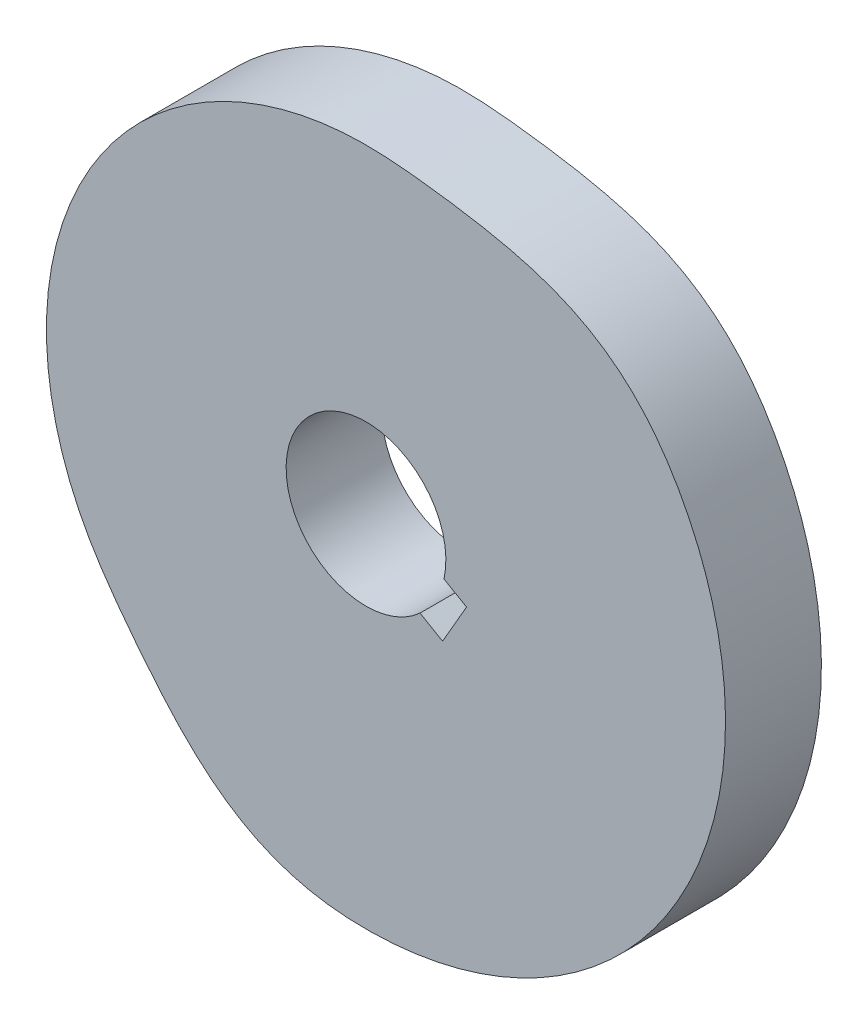
ISO-10303-21;
HEADER;
FILE_DESCRIPTION(('STEP AP214'),'2;1');
FILE_NAME('part.step','',(''),(''),'','','');
FILE_SCHEMA(('AUTOMOTIVE_DESIGN { 1 0 10303 214 1 1 1 1 }'));
ENDSEC;
DATA;
#1=APPLICATION_CONTEXT('core data for automotive mechanical design processes');
#2=APPLICATION_PROTOCOL_DEFINITION('international standard','automotive_design',2000,#1);
#3=PRODUCT_CONTEXT('',#1,'mechanical');
#4=PRODUCT('Part','Part','',(#3));
#5=PRODUCT_RELATED_PRODUCT_CATEGORY('part','',(#4));
#6=PRODUCT_DEFINITION_FORMATION('','',#4);
#7=PRODUCT_DEFINITION_CONTEXT('part definition',#1,'design');
#8=PRODUCT_DEFINITION('design','',#6,#7);
#9=PRODUCT_DEFINITION_SHAPE('','',#8);
#10=(LENGTH_UNIT() NAMED_UNIT(*) SI_UNIT(.MILLI.,.METRE.));
#11=(NAMED_UNIT(*) PLANE_ANGLE_UNIT() SI_UNIT($,.RADIAN.));
#12=(NAMED_UNIT(*) SI_UNIT($,.STERADIAN.) SOLID_ANGLE_UNIT());
#13=UNCERTAINTY_MEASURE_WITH_UNIT(LENGTH_MEASURE(1.E-05),#10,'distance_accuracy_value','');
#14=(GEOMETRIC_REPRESENTATION_CONTEXT(3) GLOBAL_UNCERTAINTY_ASSIGNED_CONTEXT((#13)) GLOBAL_UNIT_ASSIGNED_CONTEXT((#10,
#11,#12)) REPRESENTATION_CONTEXT('',''));
#15=CARTESIAN_POINT('',(0.,0.,0.));
#16=DIRECTION('',(0.,0.,1.));
#17=DIRECTION('',(1.,0.,0.));
#18=AXIS2_PLACEMENT_3D('',#15,#16,#17);
#19=CARTESIAN_POINT('',(-34.5907007104842,-20.0866237452631,12.));
#20=DIRECTION('',(0.,0.,1.));
#21=DIRECTION('',(1.,0.,0.));
#22=AXIS2_PLACEMENT_3D('',#19,#20,#21);
#23=PLANE('',#22);
#24=CARTESIAN_POINT('',(41.6040914052459,17.1493317171237,12.));
#25=CARTESIAN_POINT('',(41.1020174914144,18.3673575473884,12.));
#26=CARTESIAN_POINT('',(39.9908907436682,20.7593121750233,12.));
#27=CARTESIAN_POINT('',(38.0014596831328,24.2258629218152,12.));
#28=CARTESIAN_POINT('',(36.4606221027091,26.3698831784908,12.));
#29=CARTESIAN_POINT('',(35.6251194721866,27.3885099465134,12.));
#30=CARTESIAN_POINT('',(35.5509777435616,27.4789019412792,12.));
#31=CARTESIAN_POINT('',(35.3093521296815,27.7701037308239,12.));
#32=CARTESIAN_POINT('',(34.8916893229601,28.2548023938018,12.));
#33=CARTESIAN_POINT('',(34.3642236103499,28.835111002459,12.));
#34=CARTESIAN_POINT('',(33.8214284616267,29.4006623875112,12.));
#35=CARTESIAN_POINT('',(33.2634397017839,29.9507223900795,12.));
#36=CARTESIAN_POINT('',(32.6904898334102,30.4846075886696,12.));
#37=CARTESIAN_POINT('',(32.1029059323825,31.0016946046913,12.));
#38=CARTESIAN_POINT('',(31.5011062301754,31.5014287169865,12.));
#39=CARTESIAN_POINT('',(30.8855954460521,31.9833316448601,12.));
#40=CARTESIAN_POINT('',(30.2569589513353,32.4470083710962,12.));
#41=CARTESIAN_POINT('',(29.6158558656481,32.8921528905651,12.));
#42=CARTESIAN_POINT('',(28.9630112007715,33.3185527862826,12.));
#43=CARTESIAN_POINT('',(28.2992071813623,33.7260925527251,12.));
#44=CARTESIAN_POINT('',(27.6252738829632,34.1147556054543,12.));
#45=CARTESIAN_POINT('',(26.9420793363941,34.484624936213,12.));
#46=CARTESIAN_POINT('',(26.2505192536856,34.8358823932325,12.));
#47=CARTESIAN_POINT('',(25.5515065342268,35.1688065871312,12.));
#48=CARTESIAN_POINT('',(24.8459607108292,35.4837694431672,12.));
#49=CARTESIAN_POINT('',(24.134797494056,35.7812314404241,12.));
#50=CARTESIAN_POINT('',(23.4189185695591,36.0617355975334,12.));
#51=CARTESIAN_POINT('',(22.6992017974223,36.3259002825346,12.));
#52=CARTESIAN_POINT('',(21.9764919547547,36.5744109412834,12.));
#53=CARTESIAN_POINT('',(21.2515921531299,36.808010854258,12.));
#54=CARTESIAN_POINT('',(20.5252560510446,37.0274910455338,12.));
#55=CARTESIAN_POINT('',(19.7981809685145,37.2336794799527,12.));
#56=CARTESIAN_POINT('',(19.0710019963762,37.4274296949713,12.));
#57=CARTESIAN_POINT('',(18.3442871770079,37.6096090222078,12.));
#58=CARTESIAN_POINT('',(17.6185338162174,37.7810865602196,12.));
#59=CARTESIAN_POINT('',(16.894165968219,37.9427210644523,12.));
#60=CARTESIAN_POINT('',(16.1715331172115,38.0953489225405,12.));
#61=CARTESIAN_POINT('',(15.4509100603719,38.2397723831727,12.));
#62=CARTESIAN_POINT('',(14.7324979784421,38.3767482045367,12.));
#63=CARTESIAN_POINT('',(14.0164266618361,38.5069768839167,12.));
#64=CARTESIAN_POINT('',(13.3027578426846,38.631092623328,12.));
#65=CARTESIAN_POINT('',(12.5914895667666,38.7496541771412,12.));
#66=CARTESIAN_POINT('',(11.8825615241336,38.8631367164892,12.));
#67=CARTESIAN_POINT('',(11.175861243619,38.9719248319138,12.));
#68=CARTESIAN_POINT('',(10.47123104448,39.0763067802686,12.));
#69=CARTESIAN_POINT('',(9.76847562821939,39.176470064522,12.));
#70=CARTESIAN_POINT('',(9.06737018518749,39.2724984160128,12.));
#71=CARTESIAN_POINT('',(8.36766888386886,39.364370228242,12.));
#72=CARTESIAN_POINT('',(7.66911360575998,39.4519584698388,12.));
#73=CARTESIAN_POINT('',(6.97144278555543,39.5350320823696,12.));
#74=CARTESIAN_POINT('',(6.27440021466674,39.6132588467296,12.));
#75=CARTESIAN_POINT('',(5.5777436673017,39.6862096801998,12.));
#76=CARTESIAN_POINT('',(4.88125320765911,39.7533643061656,12.));
#77=CARTESIAN_POINT('',(4.18473905253608,39.8141182171193,12.));
#78=CARTESIAN_POINT('',(3.48804882810067,39.8677908410397,12.));
#79=CARTESIAN_POINT('',(2.7910742253825,39.9136347775381,12.));
#80=CARTESIAN_POINT('',(2.25579519350377,39.9421991135179,12.));
#81=CARTESIAN_POINT('',(1.95287633785128,39.9556761626596,12.));
#82=CARTESIAN_POINT('',(1.88247859051401,39.9586590406557,12.));
#83=CARTESIAN_POINT('',(1.46231831093852,39.976461980383,12.));
#84=CARTESIAN_POINT('',(0.621548325231796,40.0014611179778,12.));
#85=CARTESIAN_POINT('',(-0.641539846398668,40.0014894394113,12.));
#86=CARTESIAN_POINT('',(-1.48229349507988,39.974737742725,12.));
#87=CARTESIAN_POINT('',(-1.90235491205813,39.9547374636421,12.));
#88=CARTESIAN_POINT('',(-34.2028265558419,38.4168231937946,12.));
#89=CARTESIAN_POINT('',(-50.3713580964249,10.4121050817791,12.));
#90=CARTESIAN_POINT('',(-35.5529951011117,-18.3298810509051,12.));
#91=CARTESIAN_POINT('',(-35.3602851423849,-18.7036650487128,12.));
#92=CARTESIAN_POINT('',(-34.9630759669558,-19.4451549151649,12.));
#93=CARTESIAN_POINT('',(-34.3315073540373,-20.5390071983383,12.));
#94=CARTESIAN_POINT('',(-33.889472472938,-21.2546357959272,12.));
#95=CARTESIAN_POINT('',(-33.6639745350752,-21.6096038018506,12.));
#96=CARTESIAN_POINT('',(-33.6261924132981,-21.6690786003958,12.));
#97=CARTESIAN_POINT('',(-33.4630615185588,-21.9246755000866,12.));
#98=CARTESIAN_POINT('',(-33.1706845620308,-22.3739585717983,12.));
#99=CARTESIAN_POINT('',(-32.7824952470546,-22.9546343152956,12.));
#100=CARTESIAN_POINT('',(-32.3876682790341,-23.5311494362647,12.));
#101=CARTESIAN_POINT('',(-31.9867967712074,-24.1039714332199,12.));
#102=CARTESIAN_POINT('',(-31.5803939293181,-24.673572551781,12.));
#103=CARTESIAN_POINT('',(-31.1688883806231,-25.2404194027767,12.));
#104=CARTESIAN_POINT('',(-30.7526207299871,-25.8049625945056,12.));
#105=CARTESIAN_POINT('',(-30.331841461049,-26.3676264420164,12.));
#106=CARTESIAN_POINT('',(-29.906710179699,-26.928798938008,12.));
#107=CARTESIAN_POINT('',(-29.4772962057575,-27.4888221338964,12.));
#108=CARTESIAN_POINT('',(-29.0435804923669,-28.0479830825482,12.));
#109=CARTESIAN_POINT('',(-28.6054588355467,-28.6065054835503,12.));
#110=CARTESIAN_POINT('',(-28.1627463170054,-29.1645421621008,12.));
#111=CARTESIAN_POINT('',(-27.7151829051606,-29.7221685001758,12.));
#112=CARTESIAN_POINT('',(-27.2624401218827,-30.2793769248772,12.));
#113=CARTESIAN_POINT('',(-26.8041286664094,-30.8360725438215,12.));
#114=CARTESIAN_POINT('',(-26.3398068734939,-31.3920700013899,12.));
#115=CARTESIAN_POINT('',(-25.8689898705466,-31.9470916128021,12.));
#116=CARTESIAN_POINT('',(-25.3911592885762,-32.500766815457,12.));
#117=CARTESIAN_POINT('',(-24.9057733743464,-33.0526329589168,12.));
#118=CARTESIAN_POINT('',(-24.4122773464131,-33.6021374364543,12.));
#119=CARTESIAN_POINT('',(-23.9101138356203,-34.1486411423892,12.));
#120=CARTESIAN_POINT('',(-23.3987332511284,-34.6914232207099,12.));
#121=CARTESIAN_POINT('',(-22.8776039160131,-35.2296870519712,12.));
#122=CARTESIAN_POINT('',(-22.3462218217491,-35.7625674074315,12.));
#123=CARTESIAN_POINT('',(-21.8041198583108,-36.2891386821519,12.));
#124=CARTESIAN_POINT('',(-21.2508763859959,-36.8084241026055,12.));
#125=CARTESIAN_POINT('',(-20.6861230262256,-37.3194057895236,12.));
#126=CARTESIAN_POINT('',(-20.1095515613041,-37.8210355434644,12.));
#127=CARTESIAN_POINT('',(-19.5209198472419,-38.312246209164,12.));
#128=CARTESIAN_POINT('',(-18.9200566590697,-38.7919634652576,12.));
#129=CARTESIAN_POINT('',(-18.3068654043982,-39.2591178785917,12.));
#130=CARTESIAN_POINT('',(-17.6813266581237,-39.7126570571701,12.));
#131=CARTESIAN_POINT('',(-17.0434994889436,-40.1515577328405,12.));
#132=CARTESIAN_POINT('',(-16.3935215665417,-40.5748376041996,12.));
#133=CARTESIAN_POINT('',(-15.7316080567394,-40.981566771876,12.));
#134=CARTESIAN_POINT('',(-15.058049330364,-41.3708786023814,12.));
#135=CARTESIAN_POINT('',(-14.3732075298677,-41.7419798631026,12.));
#136=CARTESIAN_POINT('',(-13.6775120555671,-42.0941599797522,12.));
#137=CARTESIAN_POINT('',(-12.9714540505079,-42.4267992786674,12.));
#138=CARTESIAN_POINT('',(-12.2555799790855,-42.7393760897201,12.));
#139=CARTESIAN_POINT('',(-11.5304844093273,-43.0314726011374,12.));
#140=CARTESIAN_POINT('',(-10.7968021218384,-43.3027793750911,12.));
#141=CARTESIAN_POINT('',(-10.0551996794826,-43.553098452225,12.));
#142=CARTESIAN_POINT('',(-9.30636660061228,-43.7823449940365,12.));
#143=CARTESIAN_POINT('',(-8.551006284861,-43.9905474338023,12.));
#144=CARTESIAN_POINT('',(-7.78982684389867,-44.1778461291215,12.));
#145=CARTESIAN_POINT('',(-7.02353199046165,-44.3444905315386,12.));
#146=CARTESIAN_POINT('',(-6.39493923179174,-44.4638478008844,12.));
#147=CARTESIAN_POINT('',(-6.02193827748857,-44.5275008259357,12.));
#148=CARTESIAN_POINT('',(-5.90658564942019,-44.546513449021,12.));
#149=CARTESIAN_POINT('',(-4.60667767607008,-44.7607665679733,12.));
#150=CARTESIAN_POINT('',(-1.97948287733542,-45.0231609273912,12.));
#151=CARTESIAN_POINT('',(2.01735366318287,-45.0127833914964,12.));
#152=CARTESIAN_POINT('',(4.64441050930089,-44.7790700680491,12.));
#153=CARTESIAN_POINT('',(5.9502887776981,-44.6048659168705,12.));
#154=CARTESIAN_POINT('',(37.7852618413395,-40.358080749711,12.));
#155=CARTESIAN_POINT('',(53.8437540979118,-12.5439562683546,12.));
#156=CARTESIAN_POINT('',(41.6040914052459,17.1493317171237,12.));
#157=(BOUNDED_CURVE() B_SPLINE_CURVE(3,(#24,#25,#26,#27,#28,#29,#30,#31,#32,#33,#34,#35,#36,#37,
#38,#39,#40,#41,#42,#43,#44,#45,#46,#47,#48,#49,#50,#51,#52,#53,#54,#55,#56,#57,#58,#59,#60,#61,
#62,#63,#64,#65,#66,#67,#68,#69,#70,#71,#72,#73,#74,#75,#76,#77,#78,#79,#80,#81,#82,#83,#84,#85,
#86,#87,#88,#89,#90,#91,#92,#93,#94,#95,#96,#97,#98,#99,#100,#101,#102,#103,#104,#105,#106,#107,
#108,#109,#110,#111,#112,#113,#114,#115,#116,#117,#118,#119,#120,#121,#122,#123,#124,#125,#126,
#127,#128,#129,#130,#131,#132,#133,#134,#135,#136,#137,#138,#139,#140,#141,#142,#143,#144,#145,
#146,#147,#148,#149,#150,#151,#152,#153,#154,#155,#156),.UNSPECIFIED.,.T.,
.F.) B_SPLINE_CURVE_WITH_KNOTS((4,1,1,3,1,1,1,1,1,1,1,1,1,1,1,1,1,1,1,1,1,1,1,1,1,1,1,1,1,1,1,1,
1,1,1,1,1,1,1,1,1,1,1,1,1,1,1,1,1,1,1,1,1,1,3,1,1,3,3,1,1,3,1,1,1,1,1,1,1,1,1,1,1,1,1,1,1,1,1,1,
1,1,1,1,1,1,1,1,1,1,1,1,1,1,1,1,1,1,1,1,1,1,1,1,1,1,1,1,1,1,1,1,3,1,1,3,4),(0.,
0.0161904884466932,0.0323809768933866,0.0485714653400798,0.05000819427051,0.0532215773618582,
0.0564337692578935,0.0596446277742659,0.0628540152180113,0.0660617926902239,0.0692678124004034,
0.0724719084751493,0.0756738868277043,0.0788735147113431,0.0820705106060284,0.0852645350829743,
0.0884551832563936,0.0916419793680339,0.0948243739617943,0.0980017439975593,0.101173396130806,
0.104338573253257,0.107496464255435,0.110646216839588,0.113786953085624,0.116917787357334,
0.120037846034346,0.123146288469644,0.126242328505218,0.129325255831275,0.132394456449305,
0.135449431497699,0.13848981372212,0.141515380922946,0.14452606578958,0.147521961636664,
0.150503323689117,0.153470565719023,0.156424252013186,0.159365084839044,0.162293887769847,
0.16521158541706,0.16811918028724,0.171017727620559,0.173908309168118,0.176792006917025,
0.179669877771109,0.182542930140257,0.185412103286191,0.188278250124261,0.191142123999831,
0.194004369756258,0.196865519201976,0.199725990879079,0.200591921872403,0.205760124293804,
0.210928326715204,0.216096529136605,0.491796730957524,0.496964933379106,0.502133135800688,
0.507301338222271,0.508167269215323,0.511027740892426,0.513888890338145,0.516751136094571,
0.519615009970142,0.522481156808211,0.525350329954146,0.528223382323293,0.531101253177378,
0.533984950926285,0.536875532473844,0.539774079807163,0.542681674677343,0.545599372324556,
0.548528175255359,0.551469008081217,0.55442269437538,0.557389936405286,0.560371298457739,
0.563367194304824,0.566377879171458,0.569403446372283,0.572443828596705,0.575498803645099,
0.578568004263129,0.581650931589185,0.58474697162476,0.587855414060058,0.59097547273707,
0.59410630700878,0.597247043254816,0.600396795838969,0.603554686841147,0.606719863963598,
0.609891516096845,0.61306888613261,0.61625128072637,0.619438076838011,0.62262872501143,
0.625822749488376,0.629019745383062,0.6322193732667,0.635421351619256,0.638625447694002,
0.641831467404181,0.645039244876394,0.648248632320139,0.651459490836512,0.654671682732547,
0.657885065823895,0.6593217947542,0.675512283200976,0.691702771647752,0.707893260094528,1.),
.UNSPECIFIED.) CURVE() GEOMETRIC_REPRESENTATION_ITEM() RATIONAL_B_SPLINE_CURVE((1.,1.,1.,1.,1.,
1.,1.,1.,1.,1.,1.,1.,1.,1.,1.,1.,1.,1.,1.,1.,1.,1.,1.,1.,1.,1.,1.,1.,1.,1.,1.,1.,1.,1.,1.,1.,1.,
1.,1.,1.,1.,1.,1.,1.,1.,1.,1.,1.,1.,1.,1.,1.,1.,1.,1.,1.,1.,1.,1.,1.,1.,1.,1.,1.,
0.693747606878428,0.693747606878428,1.,1.,1.,1.,1.,1.,1.,1.,1.,1.,1.,1.,1.,1.,1.,1.,1.,1.,1.,1.,
1.,1.,1.,1.,1.,1.,1.,1.,1.,1.,1.,1.,1.,1.,1.,1.,1.,1.,1.,1.,1.,1.,1.,1.,1.,1.,1.,1.,1.,1.,1.,1.,
1.,1.,1.,1.,1.,1.,1.,1.,1.,1.,1.,1.,0.740081988144639,0.740081988144639,1.)) REPRESENTATION_ITEM(''));
#158=CARTESIAN_POINT('',(41.6040914052459,17.1493317171237,12.));
#159=VERTEX_POINT('',#158);
#160=EDGE_CURVE('E119',#159,#159,#157,.T.);
#161=ORIENTED_EDGE('',*,*,#160,.T.);
#162=EDGE_LOOP('',(#161));
#163=FACE_BOUND('',#162,.T.);
#164=DIRECTION('',(0.866025403784439,-0.5,0.));
#165=VECTOR('',#164,1.);
#166=CARTESIAN_POINT('',(9.58512512714551,-8.99807618751146,12.));
#167=LINE('',#166,#165);
#168=CARTESIAN_POINT('',(6.76135582092916,-7.36777221843804,12.));
#169=VERTEX_POINT('',#168);
#170=CARTESIAN_POINT('',(9.58512512714551,-8.99807618751146,12.));
#171=VERTEX_POINT('',#170);
#172=EDGE_CURVE('E93',#169,#171,#167,.T.);
#173=ORIENTED_EDGE('',*,*,#172,.F.);
#174=CARTESIAN_POINT('',(0.,0.,12.));
#175=DIRECTION('',(0.,0.,1.));
#176=DIRECTION('',(1.,0.,0.));
#177=AXIS2_PLACEMENT_3D('',#174,#175,#176);
#178=CIRCLE('',#177,10.);
#179=CARTESIAN_POINT('',(9.76135582092916,-2.17161979573141,12.));
#180=VERTEX_POINT('',#179);
#181=EDGE_CURVE('E84',#180,#169,#178,.T.);
#182=ORIENTED_EDGE('',*,*,#181,.F.);
#183=DIRECTION('',(-0.866025403784439,0.5,0.));
#184=VECTOR('',#183,1.);
#185=CARTESIAN_POINT('',(9.76135582092916,-2.17161979573141,12.));
#186=LINE('',#185,#184);
#187=CARTESIAN_POINT('',(12.5851251271455,-3.80192376480483,12.));
#188=VERTEX_POINT('',#187);
#189=EDGE_CURVE('E109',#188,#180,#186,.T.);
#190=ORIENTED_EDGE('',*,*,#189,.F.);
#191=DIRECTION('',(0.5,0.866025403784439,0.));
#192=VECTOR('',#191,1.);
#193=CARTESIAN_POINT('',(12.5851251271455,-3.80192376480482,12.));
#194=LINE('',#193,#192);
#195=EDGE_CURVE('E105',#171,#188,#194,.T.);
#196=ORIENTED_EDGE('',*,*,#195,.F.);
#197=EDGE_LOOP('',(#173,#182,#190,#196));
#198=FACE_BOUND('',#197,.T.);
#199=ADVANCED_FACE('F43',(#163,#198),#23,.T.);
#200=CARTESIAN_POINT('',(-34.5907007104842,-20.0866237452631,0.));
#201=DIRECTION('',(0.,0.,1.));
#202=DIRECTION('',(1.,0.,0.));
#203=AXIS2_PLACEMENT_3D('',#200,#201,#202);
#204=PLANE('',#203);
#205=CARTESIAN_POINT('',(41.6040914052459,17.1493317171237,0.));
#206=CARTESIAN_POINT('',(41.1020174914144,18.3673575473884,0.));
#207=CARTESIAN_POINT('',(39.9908907436682,20.7593121750233,0.));
#208=CARTESIAN_POINT('',(38.0014596831328,24.2258629218152,0.));
#209=CARTESIAN_POINT('',(36.4606221027091,26.3698831784908,0.));
#210=CARTESIAN_POINT('',(35.6251194721866,27.3885099465134,0.));
#211=CARTESIAN_POINT('',(35.5509777435616,27.4789019412792,0.));
#212=CARTESIAN_POINT('',(35.3093521296815,27.7701037308239,0.));
#213=CARTESIAN_POINT('',(34.8916893229601,28.2548023938018,0.));
#214=CARTESIAN_POINT('',(34.3642236103499,28.835111002459,0.));
#215=CARTESIAN_POINT('',(33.8214284616267,29.4006623875112,0.));
#216=CARTESIAN_POINT('',(33.2634397017839,29.9507223900795,0.));
#217=CARTESIAN_POINT('',(32.6904898334102,30.4846075886696,0.));
#218=CARTESIAN_POINT('',(32.1029059323825,31.0016946046913,0.));
#219=CARTESIAN_POINT('',(31.5011062301754,31.5014287169865,0.));
#220=CARTESIAN_POINT('',(30.8855954460521,31.9833316448601,0.));
#221=CARTESIAN_POINT('',(30.2569589513353,32.4470083710962,0.));
#222=CARTESIAN_POINT('',(29.6158558656481,32.8921528905651,0.));
#223=CARTESIAN_POINT('',(28.9630112007715,33.3185527862826,0.));
#224=CARTESIAN_POINT('',(28.2992071813623,33.7260925527251,0.));
#225=CARTESIAN_POINT('',(27.6252738829632,34.1147556054543,0.));
#226=CARTESIAN_POINT('',(26.9420793363941,34.484624936213,0.));
#227=CARTESIAN_POINT('',(26.2505192536856,34.8358823932325,0.));
#228=CARTESIAN_POINT('',(25.5515065342268,35.1688065871312,0.));
#229=CARTESIAN_POINT('',(24.8459607108292,35.4837694431672,0.));
#230=CARTESIAN_POINT('',(24.134797494056,35.7812314404241,0.));
#231=CARTESIAN_POINT('',(23.4189185695591,36.0617355975334,0.));
#232=CARTESIAN_POINT('',(22.6992017974223,36.3259002825346,0.));
#233=CARTESIAN_POINT('',(21.9764919547547,36.5744109412834,0.));
#234=CARTESIAN_POINT('',(21.2515921531299,36.808010854258,0.));
#235=CARTESIAN_POINT('',(20.5252560510446,37.0274910455338,0.));
#236=CARTESIAN_POINT('',(19.7981809685145,37.2336794799527,0.));
#237=CARTESIAN_POINT('',(19.0710019963762,37.4274296949713,0.));
#238=CARTESIAN_POINT('',(18.3442871770079,37.6096090222078,0.));
#239=CARTESIAN_POINT('',(17.6185338162174,37.7810865602196,0.));
#240=CARTESIAN_POINT('',(16.894165968219,37.9427210644523,0.));
#241=CARTESIAN_POINT('',(16.1715331172115,38.0953489225405,0.));
#242=CARTESIAN_POINT('',(15.4509100603719,38.2397723831727,0.));
#243=CARTESIAN_POINT('',(14.7324979784421,38.3767482045367,0.));
#244=CARTESIAN_POINT('',(14.0164266618361,38.5069768839167,0.));
#245=CARTESIAN_POINT('',(13.3027578426846,38.631092623328,0.));
#246=CARTESIAN_POINT('',(12.5914895667666,38.7496541771412,0.));
#247=CARTESIAN_POINT('',(11.8825615241336,38.8631367164892,0.));
#248=CARTESIAN_POINT('',(11.175861243619,38.9719248319138,0.));
#249=CARTESIAN_POINT('',(10.47123104448,39.0763067802686,0.));
#250=CARTESIAN_POINT('',(9.76847562821939,39.176470064522,0.));
#251=CARTESIAN_POINT('',(9.06737018518749,39.2724984160128,0.));
#252=CARTESIAN_POINT('',(8.36766888386886,39.364370228242,0.));
#253=CARTESIAN_POINT('',(7.66911360575998,39.4519584698388,0.));
#254=CARTESIAN_POINT('',(6.97144278555543,39.5350320823696,0.));
#255=CARTESIAN_POINT('',(6.27440021466674,39.6132588467296,0.));
#256=CARTESIAN_POINT('',(5.5777436673017,39.6862096801998,0.));
#257=CARTESIAN_POINT('',(4.88125320765911,39.7533643061656,0.));
#258=CARTESIAN_POINT('',(4.18473905253608,39.8141182171193,0.));
#259=CARTESIAN_POINT('',(3.48804882810067,39.8677908410397,0.));
#260=CARTESIAN_POINT('',(2.7910742253825,39.9136347775381,0.));
#261=CARTESIAN_POINT('',(2.25579519350377,39.9421991135179,0.));
#262=CARTESIAN_POINT('',(1.95287633785128,39.9556761626596,0.));
#263=CARTESIAN_POINT('',(1.88247859051401,39.9586590406557,0.));
#264=CARTESIAN_POINT('',(1.46231831093852,39.976461980383,0.));
#265=CARTESIAN_POINT('',(0.621548325231796,40.0014611179778,0.));
#266=CARTESIAN_POINT('',(-0.641539846398668,40.0014894394113,0.));
#267=CARTESIAN_POINT('',(-1.48229349507988,39.974737742725,0.));
#268=CARTESIAN_POINT('',(-1.90235491205813,39.9547374636421,0.));
#269=CARTESIAN_POINT('',(-34.2028265558419,38.4168231937946,0.));
#270=CARTESIAN_POINT('',(-50.3713580964249,10.4121050817791,0.));
#271=CARTESIAN_POINT('',(-35.5529951011117,-18.3298810509051,0.));
#272=CARTESIAN_POINT('',(-35.3602851423849,-18.7036650487128,0.));
#273=CARTESIAN_POINT('',(-34.9630759669558,-19.4451549151649,0.));
#274=CARTESIAN_POINT('',(-34.3315073540373,-20.5390071983383,0.));
#275=CARTESIAN_POINT('',(-33.889472472938,-21.2546357959272,0.));
#276=CARTESIAN_POINT('',(-33.6639745350752,-21.6096038018506,0.));
#277=CARTESIAN_POINT('',(-33.6261924132981,-21.6690786003958,0.));
#278=CARTESIAN_POINT('',(-33.4630615185588,-21.9246755000866,0.));
#279=CARTESIAN_POINT('',(-33.1706845620308,-22.3739585717983,0.));
#280=CARTESIAN_POINT('',(-32.7824952470546,-22.9546343152956,0.));
#281=CARTESIAN_POINT('',(-32.3876682790341,-23.5311494362647,0.));
#282=CARTESIAN_POINT('',(-31.9867967712074,-24.1039714332199,0.));
#283=CARTESIAN_POINT('',(-31.5803939293181,-24.673572551781,0.));
#284=CARTESIAN_POINT('',(-31.1688883806231,-25.2404194027767,0.));
#285=CARTESIAN_POINT('',(-30.7526207299871,-25.8049625945056,0.));
#286=CARTESIAN_POINT('',(-30.331841461049,-26.3676264420164,0.));
#287=CARTESIAN_POINT('',(-29.906710179699,-26.928798938008,0.));
#288=CARTESIAN_POINT('',(-29.4772962057575,-27.4888221338964,0.));
#289=CARTESIAN_POINT('',(-29.0435804923669,-28.0479830825482,0.));
#290=CARTESIAN_POINT('',(-28.6054588355467,-28.6065054835503,0.));
#291=CARTESIAN_POINT('',(-28.1627463170054,-29.1645421621008,0.));
#292=CARTESIAN_POINT('',(-27.7151829051606,-29.7221685001758,0.));
#293=CARTESIAN_POINT('',(-27.2624401218827,-30.2793769248772,0.));
#294=CARTESIAN_POINT('',(-26.8041286664094,-30.8360725438215,0.));
#295=CARTESIAN_POINT('',(-26.3398068734939,-31.3920700013899,0.));
#296=CARTESIAN_POINT('',(-25.8689898705466,-31.9470916128021,0.));
#297=CARTESIAN_POINT('',(-25.3911592885762,-32.500766815457,0.));
#298=CARTESIAN_POINT('',(-24.9057733743464,-33.0526329589168,0.));
#299=CARTESIAN_POINT('',(-24.4122773464131,-33.6021374364543,0.));
#300=CARTESIAN_POINT('',(-23.9101138356203,-34.1486411423892,0.));
#301=CARTESIAN_POINT('',(-23.3987332511284,-34.6914232207099,0.));
#302=CARTESIAN_POINT('',(-22.8776039160131,-35.2296870519712,0.));
#303=CARTESIAN_POINT('',(-22.3462218217491,-35.7625674074315,0.));
#304=CARTESIAN_POINT('',(-21.8041198583108,-36.2891386821519,0.));
#305=CARTESIAN_POINT('',(-21.2508763859959,-36.8084241026055,0.));
#306=CARTESIAN_POINT('',(-20.6861230262256,-37.3194057895236,0.));
#307=CARTESIAN_POINT('',(-20.1095515613041,-37.8210355434644,0.));
#308=CARTESIAN_POINT('',(-19.5209198472419,-38.312246209164,0.));
#309=CARTESIAN_POINT('',(-18.9200566590697,-38.7919634652576,0.));
#310=CARTESIAN_POINT('',(-18.3068654043982,-39.2591178785917,0.));
#311=CARTESIAN_POINT('',(-17.6813266581237,-39.7126570571701,0.));
#312=CARTESIAN_POINT('',(-17.0434994889436,-40.1515577328405,0.));
#313=CARTESIAN_POINT('',(-16.3935215665417,-40.5748376041996,0.));
#314=CARTESIAN_POINT('',(-15.7316080567394,-40.981566771876,0.));
#315=CARTESIAN_POINT('',(-15.058049330364,-41.3708786023814,0.));
#316=CARTESIAN_POINT('',(-14.3732075298677,-41.7419798631026,0.));
#317=CARTESIAN_POINT('',(-13.6775120555671,-42.0941599797522,0.));
#318=CARTESIAN_POINT('',(-12.9714540505079,-42.4267992786674,0.));
#319=CARTESIAN_POINT('',(-12.2555799790855,-42.7393760897201,0.));
#320=CARTESIAN_POINT('',(-11.5304844093273,-43.0314726011374,0.));
#321=CARTESIAN_POINT('',(-10.7968021218384,-43.3027793750911,0.));
#322=CARTESIAN_POINT('',(-10.0551996794826,-43.553098452225,0.));
#323=CARTESIAN_POINT('',(-9.30636660061228,-43.7823449940365,0.));
#324=CARTESIAN_POINT('',(-8.551006284861,-43.9905474338023,0.));
#325=CARTESIAN_POINT('',(-7.78982684389867,-44.1778461291215,0.));
#326=CARTESIAN_POINT('',(-7.02353199046165,-44.3444905315386,0.));
#327=CARTESIAN_POINT('',(-6.39493923179174,-44.4638478008844,0.));
#328=CARTESIAN_POINT('',(-6.02193827748857,-44.5275008259357,0.));
#329=CARTESIAN_POINT('',(-5.90658564942019,-44.546513449021,0.));
#330=CARTESIAN_POINT('',(-4.60667767607008,-44.7607665679733,0.));
#331=CARTESIAN_POINT('',(-1.97948287733542,-45.0231609273912,0.));
#332=CARTESIAN_POINT('',(2.01735366318287,-45.0127833914964,0.));
#333=CARTESIAN_POINT('',(4.64441050930089,-44.7790700680491,0.));
#334=CARTESIAN_POINT('',(5.9502887776981,-44.6048659168705,0.));
#335=CARTESIAN_POINT('',(37.7852618413395,-40.358080749711,0.));
#336=CARTESIAN_POINT('',(53.8437540979118,-12.5439562683546,0.));
#337=CARTESIAN_POINT('',(41.6040914052459,17.1493317171237,0.));
#338=(BOUNDED_CURVE() B_SPLINE_CURVE(3,(#205,#206,#207,#208,#209,#210,#211,#212,#213,#214,#215,
#216,#217,#218,#219,#220,#221,#222,#223,#224,#225,#226,#227,#228,#229,#230,#231,#232,#233,#234,
#235,#236,#237,#238,#239,#240,#241,#242,#243,#244,#245,#246,#247,#248,#249,#250,#251,#252,#253,
#254,#255,#256,#257,#258,#259,#260,#261,#262,#263,#264,#265,#266,#267,#268,#269,#270,#271,#272,
#273,#274,#275,#276,#277,#278,#279,#280,#281,#282,#283,#284,#285,#286,#287,#288,#289,#290,#291,
#292,#293,#294,#295,#296,#297,#298,#299,#300,#301,#302,#303,#304,#305,#306,#307,#308,#309,#310,
#311,#312,#313,#314,#315,#316,#317,#318,#319,#320,#321,#322,#323,#324,#325,#326,#327,#328,#329,
#330,#331,#332,#333,#334,#335,#336,#337),.UNSPECIFIED.,.T.,.F.) B_SPLINE_CURVE_WITH_KNOTS((4,1,
1,3,1,1,1,1,1,1,1,1,1,1,1,1,1,1,1,1,1,1,1,1,1,1,1,1,1,1,1,1,1,1,1,1,1,1,1,1,1,1,1,1,1,1,1,1,1,1,
1,1,1,1,3,1,1,3,3,1,1,3,1,1,1,1,1,1,1,1,1,1,1,1,1,1,1,1,1,1,1,1,1,1,1,1,1,1,1,1,1,1,1,1,1,1,1,1,
1,1,1,1,1,1,1,1,1,1,1,1,1,1,3,1,1,3,4),(0.,0.0161904884466932,0.0323809768933866,
0.0485714653400798,0.05000819427051,0.0532215773618582,0.0564337692578935,0.0596446277742659,
0.0628540152180113,0.0660617926902239,0.0692678124004034,0.0724719084751493,0.0756738868277043,
0.0788735147113431,0.0820705106060284,0.0852645350829743,0.0884551832563936,0.0916419793680339,
0.0948243739617943,0.0980017439975593,0.101173396130806,0.104338573253257,0.107496464255435,
0.110646216839588,0.113786953085624,0.116917787357334,0.120037846034346,0.123146288469644,
0.126242328505218,0.129325255831275,0.132394456449305,0.135449431497699,0.13848981372212,
0.141515380922946,0.14452606578958,0.147521961636664,0.150503323689117,0.153470565719023,
0.156424252013186,0.159365084839044,0.162293887769847,0.16521158541706,0.16811918028724,
0.171017727620559,0.173908309168118,0.176792006917025,0.179669877771109,0.182542930140257,
0.185412103286191,0.188278250124261,0.191142123999831,0.194004369756258,0.196865519201976,
0.199725990879079,0.200591921872403,0.205760124293804,0.210928326715204,0.216096529136605,
0.491796730957524,0.496964933379106,0.502133135800688,0.507301338222271,0.508167269215323,
0.511027740892426,0.513888890338145,0.516751136094571,0.519615009970142,0.522481156808211,
0.525350329954146,0.528223382323293,0.531101253177378,0.533984950926285,0.536875532473844,
0.539774079807163,0.542681674677343,0.545599372324556,0.548528175255359,0.551469008081217,
0.55442269437538,0.557389936405286,0.560371298457739,0.563367194304824,0.566377879171458,
0.569403446372283,0.572443828596705,0.575498803645099,0.578568004263129,0.581650931589185,
0.58474697162476,0.587855414060058,0.59097547273707,0.59410630700878,0.597247043254816,
0.600396795838969,0.603554686841147,0.606719863963598,0.609891516096845,0.61306888613261,
0.61625128072637,0.619438076838011,0.62262872501143,0.625822749488376,0.629019745383062,
0.6322193732667,0.635421351619256,0.638625447694002,0.641831467404181,0.645039244876394,
0.648248632320139,0.651459490836512,0.654671682732547,0.657885065823895,0.6593217947542,
0.675512283200976,0.691702771647752,0.707893260094528,1.),
.UNSPECIFIED.) CURVE() GEOMETRIC_REPRESENTATION_ITEM() RATIONAL_B_SPLINE_CURVE((1.,1.,1.,1.,1.,
1.,1.,1.,1.,1.,1.,1.,1.,1.,1.,1.,1.,1.,1.,1.,1.,1.,1.,1.,1.,1.,1.,1.,1.,1.,1.,1.,1.,1.,1.,1.,1.,
1.,1.,1.,1.,1.,1.,1.,1.,1.,1.,1.,1.,1.,1.,1.,1.,1.,1.,1.,1.,1.,1.,1.,1.,1.,1.,1.,
0.693747606878428,0.693747606878428,1.,1.,1.,1.,1.,1.,1.,1.,1.,1.,1.,1.,1.,1.,1.,1.,1.,1.,1.,1.,
1.,1.,1.,1.,1.,1.,1.,1.,1.,1.,1.,1.,1.,1.,1.,1.,1.,1.,1.,1.,1.,1.,1.,1.,1.,1.,1.,1.,1.,1.,1.,1.,
1.,1.,1.,1.,1.,1.,1.,1.,1.,1.,1.,1.,0.740081988144639,0.740081988144639,1.)) REPRESENTATION_ITEM(''));
#339=CARTESIAN_POINT('',(41.6040914052459,17.1493317171237,0.));
#340=VERTEX_POINT('',#339);
#341=EDGE_CURVE('E101',#340,#340,#338,.T.);
#342=ORIENTED_EDGE('',*,*,#341,.F.);
#343=EDGE_LOOP('',(#342));
#344=FACE_BOUND('',#343,.T.);
#345=CARTESIAN_POINT('',(0.,0.,0.));
#346=DIRECTION('',(0.,0.,1.));
#347=DIRECTION('',(1.,0.,0.));
#348=AXIS2_PLACEMENT_3D('',#345,#346,#347);
#349=CIRCLE('',#348,10.);
#350=CARTESIAN_POINT('',(6.76135582092916,-7.36777221843804,0.));
#351=VERTEX_POINT('',#350);
#352=CARTESIAN_POINT('',(9.76135582092916,-2.17161979573141,0.));
#353=VERTEX_POINT('',#352);
#354=EDGE_CURVE('E11',#351,#353,#349,.F.);
#355=ORIENTED_EDGE('',*,*,#354,.F.);
#356=DIRECTION('',(-0.866025403784439,0.5,0.));
#357=VECTOR('',#356,1.);
#358=CARTESIAN_POINT('',(-18.7452623130344,7.35848062732281,0.));
#359=LINE('',#358,#357);
#360=CARTESIAN_POINT('',(9.58512512714551,-8.99807618751146,0.));
#361=VERTEX_POINT('',#360);
#362=EDGE_CURVE('E53',#361,#351,#359,.T.);
#363=ORIENTED_EDGE('',*,*,#362,.F.);
#364=DIRECTION('',(-0.5,-0.866025403784439,0.));
#365=VECTOR('',#364,1.);
#366=CARTESIAN_POINT('',(-6.26031327030432,-36.4431805600973,0.));
#367=LINE('',#366,#365);
#368=CARTESIAN_POINT('',(12.5851251271455,-3.80192376480482,0.));
#369=VERTEX_POINT('',#368);
#370=EDGE_CURVE('E140',#369,#361,#367,.T.);
#371=ORIENTED_EDGE('',*,*,#370,.F.);
#372=DIRECTION('',(0.866025403784439,-0.5,0.));
#373=VECTOR('',#372,1.);
#374=CARTESIAN_POINT('',(-15.7452623130344,12.5546330500294,0.));
#375=LINE('',#374,#373);
#376=EDGE_CURVE('E126',#353,#369,#375,.T.);
#377=ORIENTED_EDGE('',*,*,#376,.F.);
#378=EDGE_LOOP('',(#355,#363,#371,#377));
#379=FACE_BOUND('',#378,.T.);
#380=ADVANCED_FACE('F148',(#344,#379),#204,.F.);
#381=DIRECTION('',(0.,0.,-1.));
#382=VECTOR('',#381,1.);
#383=SURFACE_OF_LINEAR_EXTRUSION('',#157,#382);
#384=ORIENTED_EDGE('',*,*,#160,.F.);
#385=EDGE_LOOP('',(#384));
#386=FACE_BOUND('',#385,.T.);
#387=ORIENTED_EDGE('',*,*,#341,.T.);
#388=EDGE_LOOP('',(#387));
#389=FACE_BOUND('',#388,.T.);
#390=ADVANCED_FACE('F45',(#386,#389),#383,.F.);
#391=CARTESIAN_POINT('',(0.,0.,12.));
#392=DIRECTION('',(0.,0.,-1.));
#393=DIRECTION('',(-1.,0.,0.));
#394=AXIS2_PLACEMENT_3D('',#391,#392,#393);
#395=CYLINDRICAL_SURFACE('',#394,10.);
#396=ORIENTED_EDGE('',*,*,#354,.T.);
#397=DIRECTION('',(0.,0.,-1.));
#398=VECTOR('',#397,1.);
#399=CARTESIAN_POINT('',(9.76135582092916,-2.17161979573141,12.));
#400=LINE('',#399,#398);
#401=EDGE_CURVE('E65',#180,#353,#400,.T.);
#402=ORIENTED_EDGE('',*,*,#401,.F.);
#403=ORIENTED_EDGE('',*,*,#181,.T.);
#404=DIRECTION('',(0.,0.,-1.));
#405=VECTOR('',#404,1.);
#406=CARTESIAN_POINT('',(6.76135582092916,-7.36777221843804,12.));
#407=LINE('',#406,#405);
#408=EDGE_CURVE('E87',#169,#351,#407,.T.);
#409=ORIENTED_EDGE('',*,*,#408,.T.);
#410=EDGE_LOOP('',(#396,#402,#403,#409));
#411=FACE_BOUND('',#410,.T.);
#412=ADVANCED_FACE('F86',(#411),#395,.F.);
#413=CARTESIAN_POINT('',(9.58512512714551,-8.99807618751146,12.));
#414=DIRECTION('',(0.5,0.866025403784439,0.));
#415=DIRECTION('',(-0.866025403784439,0.5,0.));
#416=AXIS2_PLACEMENT_3D('',#413,#414,#415);
#417=PLANE('',#416);
#418=ORIENTED_EDGE('',*,*,#362,.T.);
#419=ORIENTED_EDGE('',*,*,#408,.F.);
#420=ORIENTED_EDGE('',*,*,#172,.T.);
#421=DIRECTION('',(0.,0.,-1.));
#422=VECTOR('',#421,1.);
#423=CARTESIAN_POINT('',(9.58512512714551,-8.99807618751146,12.));
#424=LINE('',#423,#422);
#425=EDGE_CURVE('E102',#171,#361,#424,.T.);
#426=ORIENTED_EDGE('',*,*,#425,.T.);
#427=EDGE_LOOP('',(#418,#419,#420,#426));
#428=FACE_BOUND('',#427,.T.);
#429=ADVANCED_FACE('F96',(#428),#417,.T.);
#430=CARTESIAN_POINT('',(12.5851251271455,-3.80192376480482,12.));
#431=DIRECTION('',(-0.866025403784439,0.5,0.));
#432=DIRECTION('',(-0.5,-0.866025403784439,0.));
#433=AXIS2_PLACEMENT_3D('',#430,#431,#432);
#434=PLANE('',#433);
#435=ORIENTED_EDGE('',*,*,#370,.T.);
#436=ORIENTED_EDGE('',*,*,#425,.F.);
#437=ORIENTED_EDGE('',*,*,#195,.T.);
#438=DIRECTION('',(0.,0.,-1.));
#439=VECTOR('',#438,1.);
#440=CARTESIAN_POINT('',(12.5851251271455,-3.80192376480482,12.));
#441=LINE('',#440,#439);
#442=EDGE_CURVE('E60',#188,#369,#441,.T.);
#443=ORIENTED_EDGE('',*,*,#442,.T.);
#444=EDGE_LOOP('',(#435,#436,#437,#443));
#445=FACE_BOUND('',#444,.T.);
#446=ADVANCED_FACE('F145',(#445),#434,.T.);
#447=CARTESIAN_POINT('',(9.76135582092916,-2.17161979573141,12.));
#448=DIRECTION('',(-0.5,-0.866025403784439,0.));
#449=DIRECTION('',(0.866025403784439,-0.5,0.));
#450=AXIS2_PLACEMENT_3D('',#447,#448,#449);
#451=PLANE('',#450);
#452=ORIENTED_EDGE('',*,*,#376,.T.);
#453=ORIENTED_EDGE('',*,*,#442,.F.);
#454=ORIENTED_EDGE('',*,*,#189,.T.);
#455=ORIENTED_EDGE('',*,*,#401,.T.);
#456=EDGE_LOOP('',(#452,#453,#454,#455));
#457=FACE_BOUND('',#456,.T.);
#458=ADVANCED_FACE('F149',(#457),#451,.T.);
#459=CLOSED_SHELL('',(#199,#380,#390,#412,#429,#446,#458));
#460=MANIFOLD_SOLID_BREP('B2',#459);
#461=ADVANCED_BREP_SHAPE_REPRESENTATION('',(#18,#460),#14);
#462=SHAPE_DEFINITION_REPRESENTATION(#9,#461);
ENDSEC;
END-ISO-10303-21;
